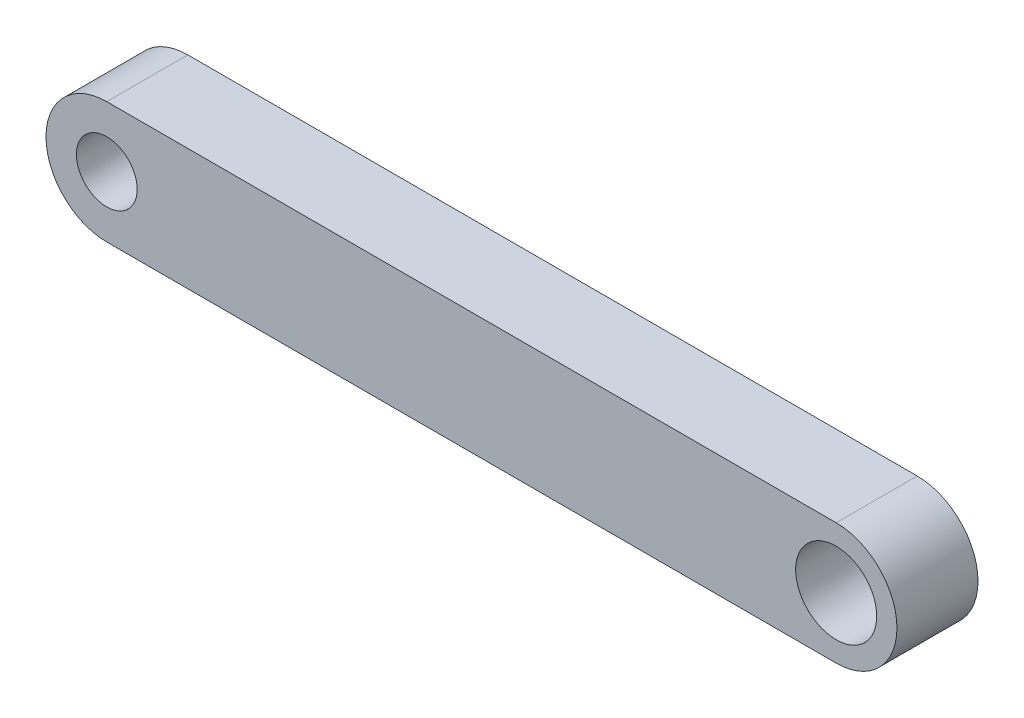
ISO-10303-21;
HEADER;
FILE_DESCRIPTION(('STEP AP214'),'2;1');
FILE_NAME('part.step','',(''),(''),'','','');
FILE_SCHEMA(('AUTOMOTIVE_DESIGN { 1 0 10303 214 1 1 1 1 }'));
ENDSEC;
DATA;
#1=APPLICATION_CONTEXT('core data for automotive mechanical design processes');
#2=APPLICATION_PROTOCOL_DEFINITION('international standard','automotive_design',2000,#1);
#3=PRODUCT_CONTEXT('',#1,'mechanical');
#4=PRODUCT('Part','Part','',(#3));
#5=PRODUCT_RELATED_PRODUCT_CATEGORY('part','',(#4));
#6=PRODUCT_DEFINITION_FORMATION('','',#4);
#7=PRODUCT_DEFINITION_CONTEXT('part definition',#1,'design');
#8=PRODUCT_DEFINITION('design','',#6,#7);
#9=PRODUCT_DEFINITION_SHAPE('','',#8);
#10=(LENGTH_UNIT() NAMED_UNIT(*) SI_UNIT(.MILLI.,.METRE.));
#11=(NAMED_UNIT(*) PLANE_ANGLE_UNIT() SI_UNIT($,.RADIAN.));
#12=(NAMED_UNIT(*) SI_UNIT($,.STERADIAN.) SOLID_ANGLE_UNIT());
#13=UNCERTAINTY_MEASURE_WITH_UNIT(LENGTH_MEASURE(1.E-05),#10,'distance_accuracy_value','');
#14=(GEOMETRIC_REPRESENTATION_CONTEXT(3) GLOBAL_UNCERTAINTY_ASSIGNED_CONTEXT((#13)) GLOBAL_UNIT_ASSIGNED_CONTEXT((#10,
#11,#12)) REPRESENTATION_CONTEXT('',''));
#15=CARTESIAN_POINT('',(0.,0.,0.));
#16=DIRECTION('',(0.,0.,1.));
#17=DIRECTION('',(1.,0.,0.));
#18=AXIS2_PLACEMENT_3D('',#15,#16,#17);
#19=CARTESIAN_POINT('',(-36.,0.,4.));
#20=DIRECTION('',(0.,0.,-1.));
#21=DIRECTION('',(-1.,0.,0.));
#22=AXIS2_PLACEMENT_3D('',#19,#20,#21);
#23=PLANE('',#22);
#24=CARTESIAN_POINT('',(-36.,0.,4.));
#25=DIRECTION('',(0.,0.,1.));
#26=DIRECTION('',(-1.,0.,0.));
#27=AXIS2_PLACEMENT_3D('',#24,#25,#26);
#28=CIRCLE('',#27,3.);
#29=CARTESIAN_POINT('',(-36.,3.,4.));
#30=VERTEX_POINT('',#29);
#31=CARTESIAN_POINT('',(-36.,-3.,4.));
#32=VERTEX_POINT('',#31);
#33=EDGE_CURVE('E97',#30,#32,#28,.T.);
#34=ORIENTED_EDGE('',*,*,#33,.T.);
#35=DIRECTION('',(1.,0.,0.));
#36=VECTOR('',#35,1.);
#37=CARTESIAN_POINT('',(0.,-3.,4.));
#38=LINE('',#37,#36);
#39=CARTESIAN_POINT('',(0.,-3.,4.));
#40=VERTEX_POINT('',#39);
#41=EDGE_CURVE('E93',#32,#40,#38,.T.);
#42=ORIENTED_EDGE('',*,*,#41,.T.);
#43=CARTESIAN_POINT('',(0.,0.,4.));
#44=DIRECTION('',(0.,0.,1.));
#45=DIRECTION('',(1.,0.,0.));
#46=AXIS2_PLACEMENT_3D('',#43,#44,#45);
#47=CIRCLE('',#46,3.);
#48=CARTESIAN_POINT('',(0.,3.,4.));
#49=VERTEX_POINT('',#48);
#50=EDGE_CURVE('E96',#40,#49,#47,.T.);
#51=ORIENTED_EDGE('',*,*,#50,.T.);
#52=DIRECTION('',(-1.,0.,0.));
#53=VECTOR('',#52,1.);
#54=CARTESIAN_POINT('',(0.,3.,4.));
#55=LINE('',#54,#53);
#56=EDGE_CURVE('E61',#49,#30,#55,.T.);
#57=ORIENTED_EDGE('',*,*,#56,.T.);
#58=EDGE_LOOP('',(#34,#42,#51,#57));
#59=FACE_BOUND('',#58,.T.);
#60=CARTESIAN_POINT('',(0.,0.,4.));
#61=DIRECTION('',(0.,0.,1.));
#62=DIRECTION('',(1.,0.,0.));
#63=AXIS2_PLACEMENT_3D('',#60,#61,#62);
#64=CIRCLE('',#63,2.);
#65=CARTESIAN_POINT('',(2.,0.,4.));
#66=VERTEX_POINT('',#65);
#67=EDGE_CURVE('E116',#66,#66,#64,.T.);
#68=ORIENTED_EDGE('',*,*,#67,.F.);
#69=EDGE_LOOP('',(#68));
#70=FACE_BOUND('',#69,.T.);
#71=CARTESIAN_POINT('',(-36.,0.,4.));
#72=DIRECTION('',(0.,0.,1.));
#73=DIRECTION('',(1.,0.,0.));
#74=AXIS2_PLACEMENT_3D('',#71,#72,#73);
#75=CIRCLE('',#74,1.5);
#76=CARTESIAN_POINT('',(-34.5,0.,4.));
#77=VERTEX_POINT('',#76);
#78=EDGE_CURVE('E139',#77,#77,#75,.T.);
#79=ORIENTED_EDGE('',*,*,#78,.F.);
#80=EDGE_LOOP('',(#79));
#81=FACE_BOUND('',#80,.T.);
#82=ADVANCED_FACE('F44',(#59,#70,#81),#23,.F.);
#83=CARTESIAN_POINT('',(-36.,0.,0.));
#84=DIRECTION('',(0.,0.,-1.));
#85=DIRECTION('',(-1.,0.,0.));
#86=AXIS2_PLACEMENT_3D('',#83,#84,#85);
#87=PLANE('',#86);
#88=CARTESIAN_POINT('',(0.,0.,0.));
#89=DIRECTION('',(0.,0.,1.));
#90=DIRECTION('',(1.,0.,0.));
#91=AXIS2_PLACEMENT_3D('',#88,#89,#90);
#92=CIRCLE('',#91,2.);
#93=CARTESIAN_POINT('',(2.,0.,0.));
#94=VERTEX_POINT('',#93);
#95=EDGE_CURVE('E136',#94,#94,#92,.T.);
#96=ORIENTED_EDGE('',*,*,#95,.T.);
#97=EDGE_LOOP('',(#96));
#98=FACE_BOUND('',#97,.T.);
#99=CARTESIAN_POINT('',(-36.,0.,0.));
#100=DIRECTION('',(0.,0.,1.));
#101=DIRECTION('',(-1.,0.,0.));
#102=AXIS2_PLACEMENT_3D('',#99,#100,#101);
#103=CIRCLE('',#102,3.);
#104=CARTESIAN_POINT('',(-36.,3.,0.));
#105=VERTEX_POINT('',#104);
#106=CARTESIAN_POINT('',(-36.,-3.,0.));
#107=VERTEX_POINT('',#106);
#108=EDGE_CURVE('E114',#105,#107,#103,.T.);
#109=ORIENTED_EDGE('',*,*,#108,.F.);
#110=DIRECTION('',(-1.,0.,0.));
#111=VECTOR('',#110,1.);
#112=CARTESIAN_POINT('',(0.,3.,0.));
#113=LINE('',#112,#111);
#114=CARTESIAN_POINT('',(0.,3.,0.));
#115=VERTEX_POINT('',#114);
#116=EDGE_CURVE('E86',#115,#105,#113,.T.);
#117=ORIENTED_EDGE('',*,*,#116,.F.);
#118=CARTESIAN_POINT('',(0.,0.,0.));
#119=DIRECTION('',(0.,0.,1.));
#120=DIRECTION('',(1.,0.,0.));
#121=AXIS2_PLACEMENT_3D('',#118,#119,#120);
#122=CIRCLE('',#121,3.);
#123=CARTESIAN_POINT('',(0.,-3.,0.));
#124=VERTEX_POINT('',#123);
#125=EDGE_CURVE('E79',#124,#115,#122,.T.);
#126=ORIENTED_EDGE('',*,*,#125,.F.);
#127=DIRECTION('',(1.,0.,0.));
#128=VECTOR('',#127,1.);
#129=CARTESIAN_POINT('',(0.,-3.,0.));
#130=LINE('',#129,#128);
#131=EDGE_CURVE('E104',#107,#124,#130,.T.);
#132=ORIENTED_EDGE('',*,*,#131,.F.);
#133=EDGE_LOOP('',(#109,#117,#126,#132));
#134=FACE_BOUND('',#133,.T.);
#135=CARTESIAN_POINT('',(-36.,0.,0.));
#136=DIRECTION('',(0.,0.,1.));
#137=DIRECTION('',(1.,0.,0.));
#138=AXIS2_PLACEMENT_3D('',#135,#136,#137);
#139=CIRCLE('',#138,1.5);
#140=CARTESIAN_POINT('',(-34.5,0.,0.));
#141=VERTEX_POINT('',#140);
#142=EDGE_CURVE('E143',#141,#141,#139,.T.);
#143=ORIENTED_EDGE('',*,*,#142,.T.);
#144=EDGE_LOOP('',(#143));
#145=FACE_BOUND('',#144,.T.);
#146=ADVANCED_FACE('F131',(#98,#134,#145),#87,.T.);
#147=CARTESIAN_POINT('',(-36.,0.,4.));
#148=DIRECTION('',(0.,0.,-1.));
#149=DIRECTION('',(-1.,0.,0.));
#150=AXIS2_PLACEMENT_3D('',#147,#148,#149);
#151=CYLINDRICAL_SURFACE('',#150,3.);
#152=ORIENTED_EDGE('',*,*,#108,.T.);
#153=DIRECTION('',(0.,0.,-1.));
#154=VECTOR('',#153,1.);
#155=CARTESIAN_POINT('',(-36.,-3.,4.));
#156=LINE('',#155,#154);
#157=EDGE_CURVE('E11',#32,#107,#156,.T.);
#158=ORIENTED_EDGE('',*,*,#157,.F.);
#159=ORIENTED_EDGE('',*,*,#33,.F.);
#160=DIRECTION('',(0.,0.,-1.));
#161=VECTOR('',#160,1.);
#162=CARTESIAN_POINT('',(-36.,3.,4.));
#163=LINE('',#162,#161);
#164=EDGE_CURVE('E109',#30,#105,#163,.T.);
#165=ORIENTED_EDGE('',*,*,#164,.T.);
#166=EDGE_LOOP('',(#152,#158,#159,#165));
#167=FACE_BOUND('',#166,.T.);
#168=ADVANCED_FACE('F50',(#167),#151,.T.);
#169=CARTESIAN_POINT('',(0.,-3.,4.));
#170=DIRECTION('',(0.,1.,0.));
#171=DIRECTION('',(-1.,0.,0.));
#172=AXIS2_PLACEMENT_3D('',#169,#170,#171);
#173=PLANE('',#172);
#174=ORIENTED_EDGE('',*,*,#131,.T.);
#175=DIRECTION('',(0.,0.,-1.));
#176=VECTOR('',#175,1.);
#177=CARTESIAN_POINT('',(0.,-3.,4.));
#178=LINE('',#177,#176);
#179=EDGE_CURVE('E54',#40,#124,#178,.T.);
#180=ORIENTED_EDGE('',*,*,#179,.F.);
#181=ORIENTED_EDGE('',*,*,#41,.F.);
#182=ORIENTED_EDGE('',*,*,#157,.T.);
#183=EDGE_LOOP('',(#174,#180,#181,#182));
#184=FACE_BOUND('',#183,.T.);
#185=ADVANCED_FACE('F105',(#184),#173,.F.);
#186=CARTESIAN_POINT('',(0.,0.,4.));
#187=DIRECTION('',(0.,0.,-1.));
#188=DIRECTION('',(-1.,0.,0.));
#189=AXIS2_PLACEMENT_3D('',#186,#187,#188);
#190=CYLINDRICAL_SURFACE('',#189,3.);
#191=ORIENTED_EDGE('',*,*,#125,.T.);
#192=DIRECTION('',(0.,0.,-1.));
#193=VECTOR('',#192,1.);
#194=CARTESIAN_POINT('',(0.,3.,4.));
#195=LINE('',#194,#193);
#196=EDGE_CURVE('E103',#49,#115,#195,.T.);
#197=ORIENTED_EDGE('',*,*,#196,.F.);
#198=ORIENTED_EDGE('',*,*,#50,.F.);
#199=ORIENTED_EDGE('',*,*,#179,.T.);
#200=EDGE_LOOP('',(#191,#197,#198,#199));
#201=FACE_BOUND('',#200,.T.);
#202=ADVANCED_FACE('F108',(#201),#190,.T.);
#203=CARTESIAN_POINT('',(0.,3.,4.));
#204=DIRECTION('',(0.,-1.,0.));
#205=DIRECTION('',(1.,0.,0.));
#206=AXIS2_PLACEMENT_3D('',#203,#204,#205);
#207=PLANE('',#206);
#208=ORIENTED_EDGE('',*,*,#116,.T.);
#209=ORIENTED_EDGE('',*,*,#164,.F.);
#210=ORIENTED_EDGE('',*,*,#56,.F.);
#211=ORIENTED_EDGE('',*,*,#196,.T.);
#212=EDGE_LOOP('',(#208,#209,#210,#211));
#213=FACE_BOUND('',#212,.T.);
#214=ADVANCED_FACE('F126',(#213),#207,.F.);
#215=CARTESIAN_POINT('',(0.,0.,4.));
#216=DIRECTION('',(0.,0.,-1.));
#217=DIRECTION('',(-1.,0.,0.));
#218=AXIS2_PLACEMENT_3D('',#215,#216,#217);
#219=CYLINDRICAL_SURFACE('',#218,2.);
#220=ORIENTED_EDGE('',*,*,#67,.T.);
#221=EDGE_LOOP('',(#220));
#222=FACE_BOUND('',#221,.T.);
#223=ORIENTED_EDGE('',*,*,#95,.F.);
#224=EDGE_LOOP('',(#223));
#225=FACE_BOUND('',#224,.T.);
#226=ADVANCED_FACE('F161',(#222,#225),#219,.F.);
#227=CARTESIAN_POINT('',(-36.,0.,4.));
#228=DIRECTION('',(0.,0.,-1.));
#229=DIRECTION('',(-1.,0.,0.));
#230=AXIS2_PLACEMENT_3D('',#227,#228,#229);
#231=CYLINDRICAL_SURFACE('',#230,1.5);
#232=ORIENTED_EDGE('',*,*,#78,.T.);
#233=EDGE_LOOP('',(#232));
#234=FACE_BOUND('',#233,.T.);
#235=ORIENTED_EDGE('',*,*,#142,.F.);
#236=EDGE_LOOP('',(#235));
#237=FACE_BOUND('',#236,.T.);
#238=ADVANCED_FACE('F155',(#234,#237),#231,.F.);
#239=CLOSED_SHELL('',(#82,#146,#168,#185,#202,#214,#226,#238));
#240=MANIFOLD_SOLID_BREP('B2',#239);
#241=ADVANCED_BREP_SHAPE_REPRESENTATION('',(#18,#240),#14);
#242=SHAPE_DEFINITION_REPRESENTATION(#9,#241);
ENDSEC;
END-ISO-10303-21;
